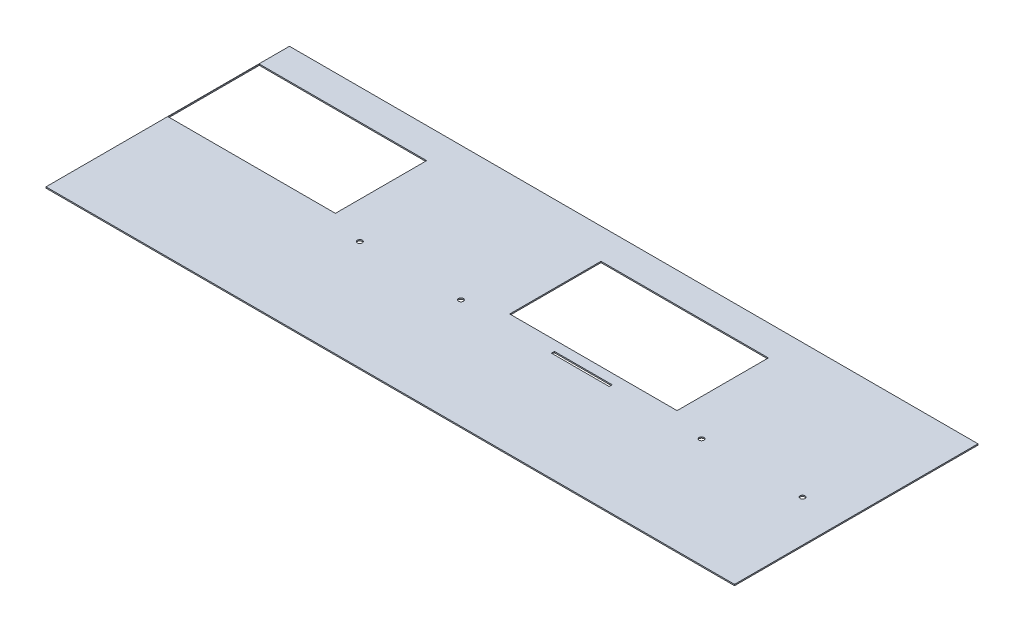
ISO-10303-21;
HEADER;
FILE_DESCRIPTION(('STEP AP214'),'2;1');
FILE_NAME('part.step','',(''),(''),'','','');
FILE_SCHEMA(('AUTOMOTIVE_DESIGN { 1 0 10303 214 1 1 1 1 }'));
ENDSEC;
DATA;
#1=APPLICATION_CONTEXT('core data for automotive mechanical design processes');
#2=APPLICATION_PROTOCOL_DEFINITION('international standard','automotive_design',2000,#1);
#3=PRODUCT_CONTEXT('',#1,'mechanical');
#4=PRODUCT('Part','Part','',(#3));
#5=PRODUCT_RELATED_PRODUCT_CATEGORY('part','',(#4));
#6=PRODUCT_DEFINITION_FORMATION('','',#4);
#7=PRODUCT_DEFINITION_CONTEXT('part definition',#1,'design');
#8=PRODUCT_DEFINITION('design','',#6,#7);
#9=PRODUCT_DEFINITION_SHAPE('','',#8);
#10=(LENGTH_UNIT() NAMED_UNIT(*) SI_UNIT(.MILLI.,.METRE.));
#11=(NAMED_UNIT(*) PLANE_ANGLE_UNIT() SI_UNIT($,.RADIAN.));
#12=(NAMED_UNIT(*) SI_UNIT($,.STERADIAN.) SOLID_ANGLE_UNIT());
#13=UNCERTAINTY_MEASURE_WITH_UNIT(LENGTH_MEASURE(1.E-05),#10,'distance_accuracy_value','');
#14=(GEOMETRIC_REPRESENTATION_CONTEXT(3) GLOBAL_UNCERTAINTY_ASSIGNED_CONTEXT((#13)) GLOBAL_UNIT_ASSIGNED_CONTEXT((#10,
#11,#12)) REPRESENTATION_CONTEXT('',''));
#15=CARTESIAN_POINT('',(0.,0.,0.));
#16=DIRECTION('',(0.,0.,1.));
#17=DIRECTION('',(1.,0.,0.));
#18=AXIS2_PLACEMENT_3D('',#15,#16,#17);
#19=CARTESIAN_POINT('',(142.,2.,200.));
#20=DIRECTION('',(0.,0.,-1.));
#21=DIRECTION('',(-1.,0.,0.));
#22=AXIS2_PLACEMENT_3D('',#19,#20,#21);
#23=PLANE('',#22);
#24=DIRECTION('',(1.,0.,0.));
#25=VECTOR('',#24,1.);
#26=CARTESIAN_POINT('',(142.,0.,200.));
#27=LINE('',#26,#25);
#28=CARTESIAN_POINT('',(-699.424777960769,-5.80091530366644E-12,200.));
#29=VERTEX_POINT('',#28);
#30=CARTESIAN_POINT('',(431.924777960769,-2.19269047363468E-12,200.));
#31=VERTEX_POINT('',#30);
#32=EDGE_CURVE('E253',#29,#31,#27,.T.);
#33=ORIENTED_EDGE('',*,*,#32,.T.);
#34=DIRECTION('',(0.,1.,0.));
#35=VECTOR('',#34,1.);
#36=CARTESIAN_POINT('',(431.924777960769,-2.13717932240343E-12,200.));
#37=LINE('',#36,#35);
#38=CARTESIAN_POINT('',(431.924777960769,1.99999999999781,200.));
#39=VERTEX_POINT('',#38);
#40=EDGE_CURVE('E318',#31,#39,#37,.T.);
#41=ORIENTED_EDGE('',*,*,#40,.T.);
#42=DIRECTION('',(1.,0.,0.));
#43=VECTOR('',#42,1.);
#44=CARTESIAN_POINT('',(142.,2.,200.));
#45=LINE('',#44,#43);
#46=CARTESIAN_POINT('',(-699.424777960769,1.9999999999942,200.));
#47=VERTEX_POINT('',#46);
#48=EDGE_CURVE('E137',#47,#39,#45,.T.);
#49=ORIENTED_EDGE('',*,*,#48,.F.);
#50=DIRECTION('',(0.,1.,0.));
#51=VECTOR('',#50,1.);
#52=CARTESIAN_POINT('',(-699.424777960769,-5.80091530366644E-12,200.));
#53=LINE('',#52,#51);
#54=EDGE_CURVE('E302',#29,#47,#53,.T.);
#55=ORIENTED_EDGE('',*,*,#54,.F.);
#56=EDGE_LOOP('',(#33,#41,#49,#55));
#57=FACE_BOUND('',#56,.T.);
#58=ADVANCED_FACE('F128',(#57),#23,.F.);
#59=CARTESIAN_POINT('',(142.,2.,-200.));
#60=DIRECTION('',(0.,0.,1.));
#61=DIRECTION('',(1.,0.,0.));
#62=AXIS2_PLACEMENT_3D('',#59,#60,#61);
#63=PLANE('',#62);
#64=DIRECTION('',(-1.,0.,0.));
#65=VECTOR('',#64,1.);
#66=CARTESIAN_POINT('',(142.,2.,-200.));
#67=LINE('',#66,#65);
#68=CARTESIAN_POINT('',(431.924777960769,1.99999999999781,-200.));
#69=VERTEX_POINT('',#68);
#70=CARTESIAN_POINT('',(-699.424777960769,1.9999999999942,-200.));
#71=VERTEX_POINT('',#70);
#72=EDGE_CURVE('E13',#69,#71,#67,.T.);
#73=ORIENTED_EDGE('',*,*,#72,.F.);
#74=DIRECTION('',(0.,1.,0.));
#75=VECTOR('',#74,1.);
#76=CARTESIAN_POINT('',(431.924777960769,-2.13717932240343E-12,-200.));
#77=LINE('',#76,#75);
#78=CARTESIAN_POINT('',(431.924777960769,-2.19269047363468E-12,-200.));
#79=VERTEX_POINT('',#78);
#80=EDGE_CURVE('E249',#79,#69,#77,.T.);
#81=ORIENTED_EDGE('',*,*,#80,.F.);
#82=DIRECTION('',(-1.,0.,0.));
#83=VECTOR('',#82,1.);
#84=CARTESIAN_POINT('',(142.,0.,-200.));
#85=LINE('',#84,#83);
#86=CARTESIAN_POINT('',(-699.424777960769,-5.80091530366644E-12,-200.));
#87=VERTEX_POINT('',#86);
#88=EDGE_CURVE('E243',#79,#87,#85,.T.);
#89=ORIENTED_EDGE('',*,*,#88,.T.);
#90=DIRECTION('',(0.,1.,0.));
#91=VECTOR('',#90,1.);
#92=CARTESIAN_POINT('',(-699.424777960769,-5.80091530366644E-12,-200.));
#93=LINE('',#92,#91);
#94=EDGE_CURVE('E247',#87,#71,#93,.T.);
#95=ORIENTED_EDGE('',*,*,#94,.T.);
#96=EDGE_LOOP('',(#73,#81,#89,#95));
#97=FACE_BOUND('',#96,.T.);
#98=ADVANCED_FACE('F245',(#97),#63,.F.);
#99=CARTESIAN_POINT('',(0.,2.,0.));
#100=DIRECTION('',(0.,1.,0.));
#101=DIRECTION('',(0.,0.,1.));
#102=AXIS2_PLACEMENT_3D('',#99,#100,#101);
#103=PLANE('',#102);
#104=DIRECTION('',(1.,0.,0.));
#105=VECTOR('',#104,1.);
#106=CARTESIAN_POINT('',(-47.5,2.,16.4999999999999));
#107=LINE('',#106,#105);
#108=CARTESIAN_POINT('',(-47.5,2.,16.4999999999999));
#109=VERTEX_POINT('',#108);
#110=CARTESIAN_POINT('',(47.5,2.,16.4999999999999));
#111=VERTEX_POINT('',#110);
#112=EDGE_CURVE('E329',#109,#111,#107,.T.);
#113=ORIENTED_EDGE('',*,*,#112,.T.);
#114=DIRECTION('',(0.,0.,1.));
#115=VECTOR('',#114,1.);
#116=CARTESIAN_POINT('',(47.5,2.,21.4999999999999));
#117=LINE('',#116,#115);
#118=CARTESIAN_POINT('',(47.5,2.,21.4999999999999));
#119=VERTEX_POINT('',#118);
#120=EDGE_CURVE('E348',#111,#119,#117,.T.);
#121=ORIENTED_EDGE('',*,*,#120,.T.);
#122=DIRECTION('',(-1.,0.,0.));
#123=VECTOR('',#122,1.);
#124=CARTESIAN_POINT('',(-47.5,2.,21.4999999999999));
#125=LINE('',#124,#123);
#126=CARTESIAN_POINT('',(-47.5,2.,21.4999999999999));
#127=VERTEX_POINT('',#126);
#128=EDGE_CURVE('E344',#119,#127,#125,.T.);
#129=ORIENTED_EDGE('',*,*,#128,.T.);
#130=DIRECTION('',(0.,0.,-1.));
#131=VECTOR('',#130,1.);
#132=CARTESIAN_POINT('',(-47.5,2.,21.4999999999999));
#133=LINE('',#132,#131);
#134=EDGE_CURVE('E340',#127,#109,#133,.T.);
#135=ORIENTED_EDGE('',*,*,#134,.T.);
#136=EDGE_LOOP('',(#113,#121,#129,#135));
#137=FACE_BOUND('',#136,.T.);
#138=DIRECTION('',(0.,0.,1.));
#139=VECTOR('',#138,1.);
#140=CARTESIAN_POINT('',(-137.5,2.,0.));
#141=LINE('',#140,#139);
#142=CARTESIAN_POINT('',(-137.5,2.,-150.));
#143=VERTEX_POINT('',#142);
#144=CARTESIAN_POINT('',(-137.5,2.,0.));
#145=VERTEX_POINT('',#144);
#146=EDGE_CURVE('E374',#143,#145,#141,.T.);
#147=ORIENTED_EDGE('',*,*,#146,.F.);
#148=DIRECTION('',(-1.,0.,0.));
#149=VECTOR('',#148,1.);
#150=CARTESIAN_POINT('',(0.,2.,-150.));
#151=LINE('',#150,#149);
#152=CARTESIAN_POINT('',(137.5,2.,-150.));
#153=VERTEX_POINT('',#152);
#154=EDGE_CURVE('E366',#153,#143,#151,.T.);
#155=ORIENTED_EDGE('',*,*,#154,.F.);
#156=DIRECTION('',(0.,0.,-1.));
#157=VECTOR('',#156,1.);
#158=CARTESIAN_POINT('',(137.5,2.,0.));
#159=LINE('',#158,#157);
#160=CARTESIAN_POINT('',(137.5,2.,0.));
#161=VERTEX_POINT('',#160);
#162=EDGE_CURVE('E368',#161,#153,#159,.T.);
#163=ORIENTED_EDGE('',*,*,#162,.F.);
#164=DIRECTION('',(1.,0.,0.));
#165=VECTOR('',#164,1.);
#166=CARTESIAN_POINT('',(0.,2.,0.));
#167=LINE('',#166,#165);
#168=EDGE_CURVE('E372',#145,#161,#167,.T.);
#169=ORIENTED_EDGE('',*,*,#168,.F.);
#170=EDGE_LOOP('',(#147,#155,#163,#169));
#171=FACE_BOUND('',#170,.T.);
#172=ORIENTED_EDGE('',*,*,#48,.T.);
#173=DIRECTION('',(0.,0.,-1.));
#174=VECTOR('',#173,1.);
#175=CARTESIAN_POINT('',(431.924777960769,1.99999999999781,200.));
#176=LINE('',#175,#174);
#177=EDGE_CURVE('E324',#69,#39,#176,.F.);
#178=ORIENTED_EDGE('',*,*,#177,.F.);
#179=ORIENTED_EDGE('',*,*,#72,.T.);
#180=DIRECTION('',(0.,0.,1.));
#181=VECTOR('',#180,1.);
#182=CARTESIAN_POINT('',(-699.424777960769,1.9999999999942,-200.));
#183=LINE('',#182,#181);
#184=EDGE_CURVE('E266',#47,#71,#183,.F.);
#185=ORIENTED_EDGE('',*,*,#184,.F.);
#186=EDGE_LOOP('',(#172,#178,#179,#185));
#187=FACE_BOUND('',#186,.T.);
#188=CARTESIAN_POINT('',(197.712388980385,1.99999999999964,19.9999999999999));
#189=DIRECTION('',(0.,-1.,0.));
#190=DIRECTION('',(1.,0.,0.));
#191=AXIS2_PLACEMENT_3D('',#188,#189,#190);
#192=CIRCLE('',#191,4.00000000000001);
#193=CARTESIAN_POINT('',(201.712388980385,1.99999999999956,19.9999999999999));
#194=VERTEX_POINT('',#193);
#195=EDGE_CURVE('E309',#194,#194,#192,.T.);
#196=ORIENTED_EDGE('',*,*,#195,.T.);
#197=EDGE_LOOP('',(#196));
#198=FACE_BOUND('',#197,.T.);
#199=CARTESIAN_POINT('',(363.712388980385,1.99999999999848,20.));
#200=DIRECTION('',(0.,-1.,0.));
#201=DIRECTION('',(1.,0.,0.));
#202=AXIS2_PLACEMENT_3D('',#199,#200,#201);
#203=CIRCLE('',#202,4.00000000000001);
#204=CARTESIAN_POINT('',(367.712388980385,1.99999999999845,20.));
#205=VERTEX_POINT('',#204);
#206=EDGE_CURVE('E305',#205,#205,#203,.T.);
#207=ORIENTED_EDGE('',*,*,#206,.T.);
#208=EDGE_LOOP('',(#207));
#209=FACE_BOUND('',#208,.T.);
#210=DIRECTION('',(0.,0.,-1.));
#211=VECTOR('',#210,1.);
#212=CARTESIAN_POINT('',(-423.92477796077,1.99999999999806,0.));
#213=LINE('',#212,#211);
#214=CARTESIAN_POINT('',(-423.92477796077,1.99999999999712,0.));
#215=VERTEX_POINT('',#214);
#216=CARTESIAN_POINT('',(-423.92477796077,1.99999999999806,-150.));
#217=VERTEX_POINT('',#216);
#218=EDGE_CURVE('E278',#215,#217,#213,.T.);
#219=ORIENTED_EDGE('',*,*,#218,.F.);
#220=DIRECTION('',(1.,0.,0.));
#221=VECTOR('',#220,1.);
#222=CARTESIAN_POINT('',(-561.424777960768,1.99999999999614,0.));
#223=LINE('',#222,#221);
#224=CARTESIAN_POINT('',(-698.92477796077,1.99999999999423,0.));
#225=VERTEX_POINT('',#224);
#226=EDGE_CURVE('E286',#225,#215,#223,.T.);
#227=ORIENTED_EDGE('',*,*,#226,.F.);
#228=DIRECTION('',(0.,0.,1.));
#229=VECTOR('',#228,1.);
#230=CARTESIAN_POINT('',(-698.92477796077,1.99999999999423,0.));
#231=LINE('',#230,#229);
#232=CARTESIAN_POINT('',(-698.92477796077,1.99999999999517,-150.));
#233=VERTEX_POINT('',#232);
#234=EDGE_CURVE('E294',#233,#225,#231,.T.);
#235=ORIENTED_EDGE('',*,*,#234,.F.);
#236=DIRECTION('',(-1.,0.,0.));
#237=VECTOR('',#236,1.);
#238=CARTESIAN_POINT('',(-561.424777960768,1.99999999999614,-150.));
#239=LINE('',#238,#237);
#240=EDGE_CURVE('E300',#217,#233,#239,.T.);
#241=ORIENTED_EDGE('',*,*,#240,.F.);
#242=EDGE_LOOP('',(#219,#227,#235,#241));
#243=FACE_BOUND('',#242,.T.);
#244=CARTESIAN_POINT('',(-197.712388980386,1.99999999999964,19.9999999999999));
#245=DIRECTION('',(0.,-1.,0.));
#246=DIRECTION('',(1.,0.,0.));
#247=AXIS2_PLACEMENT_3D('',#244,#245,#246);
#248=CIRCLE('',#247,4.00000000000001);
#249=CARTESIAN_POINT('',(-201.712388980386,1.99999999999961,19.9999999999999));
#250=VERTEX_POINT('',#249);
#251=EDGE_CURVE('E267',#250,#250,#248,.T.);
#252=ORIENTED_EDGE('',*,*,#251,.T.);
#253=EDGE_LOOP('',(#252));
#254=FACE_BOUND('',#253,.T.);
#255=CARTESIAN_POINT('',(-363.712388980386,1.99999999999848,20.));
#256=DIRECTION('',(0.,-1.,0.));
#257=DIRECTION('',(1.,0.,0.));
#258=AXIS2_PLACEMENT_3D('',#255,#256,#257);
#259=CIRCLE('',#258,4.00000000000001);
#260=CARTESIAN_POINT('',(-367.712388980386,1.99999999999845,20.));
#261=VERTEX_POINT('',#260);
#262=EDGE_CURVE('E270',#261,#261,#259,.T.);
#263=ORIENTED_EDGE('',*,*,#262,.T.);
#264=EDGE_LOOP('',(#263));
#265=FACE_BOUND('',#264,.T.);
#266=ADVANCED_FACE('F400',(#137,#171,#187,#198,#209,#243,#254,#265),#103,.T.);
#267=CARTESIAN_POINT('',(0.,0.,0.));
#268=DIRECTION('',(0.,1.,0.));
#269=DIRECTION('',(0.,0.,1.));
#270=AXIS2_PLACEMENT_3D('',#267,#268,#269);
#271=PLANE('',#270);
#272=DIRECTION('',(0.,0.,1.));
#273=VECTOR('',#272,1.);
#274=CARTESIAN_POINT('',(47.5,0.,21.4999999999999));
#275=LINE('',#274,#273);
#276=CARTESIAN_POINT('',(47.5,0.,16.4999999999999));
#277=VERTEX_POINT('',#276);
#278=CARTESIAN_POINT('',(47.5,0.,21.4999999999999));
#279=VERTEX_POINT('',#278);
#280=EDGE_CURVE('E330',#277,#279,#275,.T.);
#281=ORIENTED_EDGE('',*,*,#280,.F.);
#282=DIRECTION('',(1.,0.,0.));
#283=VECTOR('',#282,1.);
#284=CARTESIAN_POINT('',(-47.5,0.,16.4999999999999));
#285=LINE('',#284,#283);
#286=CARTESIAN_POINT('',(-47.5,0.,16.4999999999999));
#287=VERTEX_POINT('',#286);
#288=EDGE_CURVE('E333',#287,#277,#285,.T.);
#289=ORIENTED_EDGE('',*,*,#288,.F.);
#290=DIRECTION('',(0.,0.,-1.));
#291=VECTOR('',#290,1.);
#292=CARTESIAN_POINT('',(-47.5,0.,21.4999999999999));
#293=LINE('',#292,#291);
#294=CARTESIAN_POINT('',(-47.5,0.,21.4999999999999));
#295=VERTEX_POINT('',#294);
#296=EDGE_CURVE('E308',#295,#287,#293,.T.);
#297=ORIENTED_EDGE('',*,*,#296,.F.);
#298=DIRECTION('',(-1.,0.,0.));
#299=VECTOR('',#298,1.);
#300=CARTESIAN_POINT('',(-47.5,0.,21.4999999999999));
#301=LINE('',#300,#299);
#302=EDGE_CURVE('E153',#279,#295,#301,.T.);
#303=ORIENTED_EDGE('',*,*,#302,.F.);
#304=EDGE_LOOP('',(#281,#289,#297,#303));
#305=FACE_BOUND('',#304,.T.);
#306=DIRECTION('',(1.,0.,0.));
#307=VECTOR('',#306,1.);
#308=CARTESIAN_POINT('',(-137.5,0.,-150.));
#309=LINE('',#308,#307);
#310=CARTESIAN_POINT('',(-137.5,0.,-150.));
#311=VERTEX_POINT('',#310);
#312=CARTESIAN_POINT('',(137.5,0.,-150.));
#313=VERTEX_POINT('',#312);
#314=EDGE_CURVE('E357',#311,#313,#309,.T.);
#315=ORIENTED_EDGE('',*,*,#314,.F.);
#316=DIRECTION('',(0.,0.,-1.));
#317=VECTOR('',#316,1.);
#318=CARTESIAN_POINT('',(-137.5,0.,0.));
#319=LINE('',#318,#317);
#320=CARTESIAN_POINT('',(-137.5,0.,0.));
#321=VERTEX_POINT('',#320);
#322=EDGE_CURVE('E355',#321,#311,#319,.T.);
#323=ORIENTED_EDGE('',*,*,#322,.F.);
#324=DIRECTION('',(-1.,0.,0.));
#325=VECTOR('',#324,1.);
#326=CARTESIAN_POINT('',(-137.5,0.,0.));
#327=LINE('',#326,#325);
#328=CARTESIAN_POINT('',(137.5,0.,0.));
#329=VERTEX_POINT('',#328);
#330=EDGE_CURVE('E363',#329,#321,#327,.T.);
#331=ORIENTED_EDGE('',*,*,#330,.F.);
#332=DIRECTION('',(0.,0.,1.));
#333=VECTOR('',#332,1.);
#334=CARTESIAN_POINT('',(137.5,0.,0.));
#335=LINE('',#334,#333);
#336=EDGE_CURVE('E360',#313,#329,#335,.T.);
#337=ORIENTED_EDGE('',*,*,#336,.F.);
#338=EDGE_LOOP('',(#315,#323,#331,#337));
#339=FACE_BOUND('',#338,.T.);
#340=ORIENTED_EDGE('',*,*,#88,.F.);
#341=DIRECTION('',(0.,0.,1.));
#342=VECTOR('',#341,1.);
#343=CARTESIAN_POINT('',(431.924777960769,-2.19269047363468E-12,0.));
#344=LINE('',#343,#342);
#345=EDGE_CURVE('E321',#79,#31,#344,.T.);
#346=ORIENTED_EDGE('',*,*,#345,.T.);
#347=ORIENTED_EDGE('',*,*,#32,.F.);
#348=DIRECTION('',(0.,0.,-1.));
#349=VECTOR('',#348,1.);
#350=CARTESIAN_POINT('',(-699.424777960769,-5.80091530366644E-12,0.));
#351=LINE('',#350,#349);
#352=EDGE_CURVE('E256',#29,#87,#351,.T.);
#353=ORIENTED_EDGE('',*,*,#352,.T.);
#354=EDGE_LOOP('',(#340,#346,#347,#353));
#355=FACE_BOUND('',#354,.T.);
#356=CARTESIAN_POINT('',(197.712388980385,-3.60822483003176E-13,19.9999999999999));
#357=DIRECTION('',(0.,-1.,0.));
#358=DIRECTION('',(1.,0.,0.));
#359=AXIS2_PLACEMENT_3D('',#356,#357,#358);
#360=CIRCLE('',#359,4.00000000000001);
#361=CARTESIAN_POINT('',(201.712388980385,-4.44089209850063E-13,19.9999999999999));
#362=VERTEX_POINT('',#361);
#363=EDGE_CURVE('E312',#362,#362,#360,.T.);
#364=ORIENTED_EDGE('',*,*,#363,.F.);
#365=EDGE_LOOP('',(#364));
#366=FACE_BOUND('',#365,.T.);
#367=CARTESIAN_POINT('',(363.712388980385,-1.52655665885959E-12,20.));
#368=DIRECTION('',(0.,-1.,0.));
#369=DIRECTION('',(1.,0.,0.));
#370=AXIS2_PLACEMENT_3D('',#367,#368,#369);
#371=CIRCLE('',#370,4.00000000000001);
#372=CARTESIAN_POINT('',(367.712388980385,-1.55431223447522E-12,20.));
#373=VERTEX_POINT('',#372);
#374=EDGE_CURVE('E315',#373,#373,#371,.T.);
#375=ORIENTED_EDGE('',*,*,#374,.F.);
#376=EDGE_LOOP('',(#375));
#377=FACE_BOUND('',#376,.T.);
#378=CARTESIAN_POINT('',(-197.712388980386,-3.60822483003176E-13,19.9999999999999));
#379=DIRECTION('',(0.,-1.,0.));
#380=DIRECTION('',(1.,0.,0.));
#381=AXIS2_PLACEMENT_3D('',#378,#379,#380);
#382=CIRCLE('',#381,4.00000000000001);
#383=CARTESIAN_POINT('',(-201.712388980386,-3.86843335142828E-13,19.9999999999999));
#384=VERTEX_POINT('',#383);
#385=EDGE_CURVE('E784',#384,#384,#382,.F.);
#386=ORIENTED_EDGE('',*,*,#385,.T.);
#387=EDGE_LOOP('',(#386));
#388=FACE_BOUND('',#387,.T.);
#389=CARTESIAN_POINT('',(-363.712388980386,-1.52655665885959E-12,20.));
#390=DIRECTION('',(0.,-1.,0.));
#391=DIRECTION('',(1.,0.,0.));
#392=AXIS2_PLACEMENT_3D('',#389,#390,#391);
#393=CIRCLE('',#392,4.00000000000001);
#394=CARTESIAN_POINT('',(-367.712388980386,-1.55257751099924E-12,20.));
#395=VERTEX_POINT('',#394);
#396=EDGE_CURVE('E327',#395,#395,#393,.F.);
#397=ORIENTED_EDGE('',*,*,#396,.T.);
#398=EDGE_LOOP('',(#397));
#399=FACE_BOUND('',#398,.T.);
#400=DIRECTION('',(-1.,0.,0.));
#401=VECTOR('',#400,1.);
#402=CARTESIAN_POINT('',(-423.924777960772,-1.94289029309402E-12,0.));
#403=LINE('',#402,#401);
#404=CARTESIAN_POINT('',(-423.92477796077,-1.94289029309402E-12,0.));
#405=VERTEX_POINT('',#404);
#406=CARTESIAN_POINT('',(-698.92477796077,-5.77315972805081E-12,0.));
#407=VERTEX_POINT('',#406);
#408=EDGE_CURVE('E284',#405,#407,#403,.T.);
#409=ORIENTED_EDGE('',*,*,#408,.F.);
#410=DIRECTION('',(0.,0.,1.));
#411=VECTOR('',#410,1.);
#412=CARTESIAN_POINT('',(-423.92477796077,-1.94289029309402E-12,0.));
#413=LINE('',#412,#411);
#414=CARTESIAN_POINT('',(-423.92477796077,-1.94289029309402E-12,-150.));
#415=VERTEX_POINT('',#414);
#416=EDGE_CURVE('E276',#415,#405,#413,.T.);
#417=ORIENTED_EDGE('',*,*,#416,.F.);
#418=DIRECTION('',(1.,0.,0.));
#419=VECTOR('',#418,1.);
#420=CARTESIAN_POINT('',(-423.924777960772,-1.94289029309402E-12,-150.));
#421=LINE('',#420,#419);
#422=CARTESIAN_POINT('',(-698.92477796077,-5.77315972805081E-12,-150.));
#423=VERTEX_POINT('',#422);
#424=EDGE_CURVE('E298',#423,#415,#421,.T.);
#425=ORIENTED_EDGE('',*,*,#424,.F.);
#426=DIRECTION('',(0.,0.,-1.));
#427=VECTOR('',#426,1.);
#428=CARTESIAN_POINT('',(-698.92477796077,-5.77315972805081E-12,0.));
#429=LINE('',#428,#427);
#430=EDGE_CURVE('E291',#407,#423,#429,.T.);
#431=ORIENTED_EDGE('',*,*,#430,.F.);
#432=EDGE_LOOP('',(#409,#417,#425,#431));
#433=FACE_BOUND('',#432,.T.);
#434=ADVANCED_FACE('F130',(#305,#339,#355,#366,#377,#388,#399,#433),#271,.F.);
#435=CARTESIAN_POINT('',(-137.5,597.249102153543,0.));
#436=DIRECTION('',(-1.,0.,0.));
#437=DIRECTION('',(0.,0.,1.));
#438=AXIS2_PLACEMENT_3D('',#435,#436,#437);
#439=PLANE('',#438);
#440=ORIENTED_EDGE('',*,*,#146,.T.);
#441=DIRECTION('',(0.,-1.,0.));
#442=VECTOR('',#441,1.);
#443=CARTESIAN_POINT('',(-137.5,597.249102153543,0.));
#444=LINE('',#443,#442);
#445=EDGE_CURVE('E369',#145,#321,#444,.T.);
#446=ORIENTED_EDGE('',*,*,#445,.T.);
#447=ORIENTED_EDGE('',*,*,#322,.T.);
#448=DIRECTION('',(0.,-1.,0.));
#449=VECTOR('',#448,1.);
#450=CARTESIAN_POINT('',(-137.5,597.249102153543,-150.));
#451=LINE('',#450,#449);
#452=EDGE_CURVE('E132',#143,#311,#451,.T.);
#453=ORIENTED_EDGE('',*,*,#452,.F.);
#454=EDGE_LOOP('',(#440,#446,#447,#453));
#455=FACE_BOUND('',#454,.T.);
#456=ADVANCED_FACE('F403',(#455),#439,.F.);
#457=CARTESIAN_POINT('',(-137.5,597.249102153543,0.));
#458=DIRECTION('',(0.,0.,1.));
#459=DIRECTION('',(1.,0.,0.));
#460=AXIS2_PLACEMENT_3D('',#457,#458,#459);
#461=PLANE('',#460);
#462=ORIENTED_EDGE('',*,*,#168,.T.);
#463=DIRECTION('',(0.,-1.,0.));
#464=VECTOR('',#463,1.);
#465=CARTESIAN_POINT('',(137.5,597.249102153543,0.));
#466=LINE('',#465,#464);
#467=EDGE_CURVE('E379',#161,#329,#466,.T.);
#468=ORIENTED_EDGE('',*,*,#467,.T.);
#469=ORIENTED_EDGE('',*,*,#330,.T.);
#470=ORIENTED_EDGE('',*,*,#445,.F.);
#471=EDGE_LOOP('',(#462,#468,#469,#470));
#472=FACE_BOUND('',#471,.T.);
#473=ADVANCED_FACE('F404',(#472),#461,.F.);
#474=CARTESIAN_POINT('',(137.5,597.249102153543,0.));
#475=DIRECTION('',(1.,0.,0.));
#476=DIRECTION('',(0.,0.,-1.));
#477=AXIS2_PLACEMENT_3D('',#474,#475,#476);
#478=PLANE('',#477);
#479=ORIENTED_EDGE('',*,*,#162,.T.);
#480=DIRECTION('',(0.,-1.,0.));
#481=VECTOR('',#480,1.);
#482=CARTESIAN_POINT('',(137.5,597.249102153543,-150.));
#483=LINE('',#482,#481);
#484=EDGE_CURVE('E380',#153,#313,#483,.T.);
#485=ORIENTED_EDGE('',*,*,#484,.T.);
#486=ORIENTED_EDGE('',*,*,#336,.T.);
#487=ORIENTED_EDGE('',*,*,#467,.F.);
#488=EDGE_LOOP('',(#479,#485,#486,#487));
#489=FACE_BOUND('',#488,.T.);
#490=ADVANCED_FACE('F395',(#489),#478,.F.);
#491=CARTESIAN_POINT('',(-137.5,597.249102153543,-150.));
#492=DIRECTION('',(0.,0.,-1.));
#493=DIRECTION('',(-1.,0.,0.));
#494=AXIS2_PLACEMENT_3D('',#491,#492,#493);
#495=PLANE('',#494);
#496=ORIENTED_EDGE('',*,*,#154,.T.);
#497=ORIENTED_EDGE('',*,*,#452,.T.);
#498=ORIENTED_EDGE('',*,*,#314,.T.);
#499=ORIENTED_EDGE('',*,*,#484,.F.);
#500=EDGE_LOOP('',(#496,#497,#498,#499));
#501=FACE_BOUND('',#500,.T.);
#502=ADVANCED_FACE('F386',(#501),#495,.F.);
#503=CARTESIAN_POINT('',(-47.5,97.1314879522022,16.4999999999999));
#504=DIRECTION('',(0.,0.,-1.));
#505=DIRECTION('',(-1.,0.,0.));
#506=AXIS2_PLACEMENT_3D('',#503,#504,#505);
#507=PLANE('',#506);
#508=DIRECTION('',(0.,-1.,0.));
#509=VECTOR('',#508,1.);
#510=CARTESIAN_POINT('',(-47.5,97.1314879522022,16.4999999999999));
#511=LINE('',#510,#509);
#512=EDGE_CURVE('E145',#109,#287,#511,.T.);
#513=ORIENTED_EDGE('',*,*,#512,.T.);
#514=ORIENTED_EDGE('',*,*,#288,.T.);
#515=DIRECTION('',(0.,-1.,0.));
#516=VECTOR('',#515,1.);
#517=CARTESIAN_POINT('',(47.5,97.1314879522022,16.4999999999999));
#518=LINE('',#517,#516);
#519=EDGE_CURVE('E339',#111,#277,#518,.T.);
#520=ORIENTED_EDGE('',*,*,#519,.F.);
#521=ORIENTED_EDGE('',*,*,#112,.F.);
#522=EDGE_LOOP('',(#513,#514,#520,#521));
#523=FACE_BOUND('',#522,.T.);
#524=ADVANCED_FACE('F423',(#523),#507,.F.);
#525=CARTESIAN_POINT('',(47.5,97.1314879522022,21.4999999999999));
#526=DIRECTION('',(1.,0.,0.));
#527=DIRECTION('',(0.,0.,-1.));
#528=AXIS2_PLACEMENT_3D('',#525,#526,#527);
#529=PLANE('',#528);
#530=ORIENTED_EDGE('',*,*,#519,.T.);
#531=ORIENTED_EDGE('',*,*,#280,.T.);
#532=DIRECTION('',(0.,-1.,0.));
#533=VECTOR('',#532,1.);
#534=CARTESIAN_POINT('',(47.5,97.1314879522022,21.4999999999999));
#535=LINE('',#534,#533);
#536=EDGE_CURVE('E347',#119,#279,#535,.T.);
#537=ORIENTED_EDGE('',*,*,#536,.F.);
#538=ORIENTED_EDGE('',*,*,#120,.F.);
#539=EDGE_LOOP('',(#530,#531,#537,#538));
#540=FACE_BOUND('',#539,.T.);
#541=ADVANCED_FACE('F427',(#540),#529,.F.);
#542=CARTESIAN_POINT('',(-47.5,97.1314879522022,21.4999999999999));
#543=DIRECTION('',(0.,0.,1.));
#544=DIRECTION('',(1.,0.,0.));
#545=AXIS2_PLACEMENT_3D('',#542,#543,#544);
#546=PLANE('',#545);
#547=ORIENTED_EDGE('',*,*,#536,.T.);
#548=ORIENTED_EDGE('',*,*,#302,.T.);
#549=DIRECTION('',(0.,-1.,0.));
#550=VECTOR('',#549,1.);
#551=CARTESIAN_POINT('',(-47.5,97.1314879522022,21.4999999999999));
#552=LINE('',#551,#550);
#553=EDGE_CURVE('E343',#127,#295,#552,.T.);
#554=ORIENTED_EDGE('',*,*,#553,.F.);
#555=ORIENTED_EDGE('',*,*,#128,.F.);
#556=EDGE_LOOP('',(#547,#548,#554,#555));
#557=FACE_BOUND('',#556,.T.);
#558=ADVANCED_FACE('F433',(#557),#546,.F.);
#559=CARTESIAN_POINT('',(-47.5,97.1314879522022,21.4999999999999));
#560=DIRECTION('',(-1.,0.,0.));
#561=DIRECTION('',(0.,0.,1.));
#562=AXIS2_PLACEMENT_3D('',#559,#560,#561);
#563=PLANE('',#562);
#564=ORIENTED_EDGE('',*,*,#553,.T.);
#565=ORIENTED_EDGE('',*,*,#296,.T.);
#566=ORIENTED_EDGE('',*,*,#512,.F.);
#567=ORIENTED_EDGE('',*,*,#134,.F.);
#568=EDGE_LOOP('',(#564,#565,#566,#567));
#569=FACE_BOUND('',#568,.T.);
#570=ADVANCED_FACE('F448',(#569),#563,.F.);
#571=CARTESIAN_POINT('',(431.924777960769,-2.13717932240343E-12,200.));
#572=DIRECTION('',(-1.,0.,0.));
#573=DIRECTION('',(0.,-1.,0.));
#574=AXIS2_PLACEMENT_3D('',#571,#572,#573);
#575=PLANE('',#574);
#576=ORIENTED_EDGE('',*,*,#177,.T.);
#577=ORIENTED_EDGE('',*,*,#40,.F.);
#578=ORIENTED_EDGE('',*,*,#345,.F.);
#579=ORIENTED_EDGE('',*,*,#80,.T.);
#580=EDGE_LOOP('',(#576,#577,#578,#579));
#581=FACE_BOUND('',#580,.T.);
#582=ADVANCED_FACE('F450',(#581),#575,.F.);
#583=CARTESIAN_POINT('',(363.712388980387,295.313708498985,20.));
#584=DIRECTION('',(0.,-1.,0.));
#585=DIRECTION('',(1.,0.,0.));
#586=AXIS2_PLACEMENT_3D('',#583,#584,#585);
#587=CYLINDRICAL_SURFACE('',#586,4.00000000000001);
#588=CARTESIAN_POINT('',(367.712388980385,-1.55431223447522E-12,20.));
#589=CARTESIAN_POINT('',(367.712388980385,0.020833333331786,20.));
#590=CARTESIAN_POINT('',(367.712388980385,0.0416666666651263,20.));
#591=CARTESIAN_POINT('',(367.712388980385,0.0833333333317883,20.));
#592=CARTESIAN_POINT('',(367.712388980385,0.10416666666511,20.));
#593=CARTESIAN_POINT('',(367.712388980385,0.145833333331772,20.));
#594=CARTESIAN_POINT('',(367.712388980385,0.166666666665113,20.));
#595=CARTESIAN_POINT('',(367.712388980385,0.208333333331775,20.));
#596=CARTESIAN_POINT('',(367.712388980385,0.229166666665096,20.));
#597=CARTESIAN_POINT('',(367.712388980385,0.270833333331758,20.));
#598=CARTESIAN_POINT('',(367.712388980385,0.291666666665099,20.));
#599=CARTESIAN_POINT('',(367.712388980385,0.333333333331779,20.));
#600=CARTESIAN_POINT('',(367.712388980385,0.35416666666512,20.));
#601=CARTESIAN_POINT('',(367.712388980385,0.395833333331782,20.));
#602=CARTESIAN_POINT('',(367.712388980385,0.416666666665103,20.));
#603=CARTESIAN_POINT('',(367.712388980385,0.458333333331766,20.));
#604=CARTESIAN_POINT('',(367.712388980385,0.479166666665106,20.));
#605=CARTESIAN_POINT('',(367.712388980385,0.520833333331786,20.));
#606=CARTESIAN_POINT('',(367.712388980385,0.541666666665127,20.));
#607=CARTESIAN_POINT('',(367.712388980385,0.583333333331789,20.));
#608=CARTESIAN_POINT('',(367.712388980385,0.604166666665111,20.));
#609=CARTESIAN_POINT('',(367.712388980385,0.645833333331773,20.));
#610=CARTESIAN_POINT('',(367.712388980385,0.666666666665113,20.));
#611=CARTESIAN_POINT('',(367.712388980385,0.708333333331793,20.));
#612=CARTESIAN_POINT('',(367.712388980385,0.729166666665134,20.));
#613=CARTESIAN_POINT('',(367.712388980385,0.770833333331796,20.));
#614=CARTESIAN_POINT('',(367.712388980385,0.791666666665118,20.));
#615=CARTESIAN_POINT('',(367.712388980385,0.83333333333178,20.));
#616=CARTESIAN_POINT('',(367.712388980385,0.85416666666512,20.));
#617=CARTESIAN_POINT('',(367.712388980385,0.895833333331782,20.));
#618=CARTESIAN_POINT('',(367.712388980385,0.916666666665104,20.));
#619=CARTESIAN_POINT('',(367.712388980385,0.958333333331766,20.));
#620=CARTESIAN_POINT('',(367.712388980385,0.979166666665106,20.));
#621=CARTESIAN_POINT('',(367.712388980385,1.02083333333179,20.));
#622=CARTESIAN_POINT('',(367.712388980385,1.04166666666513,20.));
#623=CARTESIAN_POINT('',(367.712388980385,1.08333333333179,20.));
#624=CARTESIAN_POINT('',(367.712388980385,1.10416666666511,20.));
#625=CARTESIAN_POINT('',(367.712388980385,1.14583333333177,20.));
#626=CARTESIAN_POINT('',(367.712388980385,1.16666666666511,20.));
#627=CARTESIAN_POINT('',(367.712388980385,1.20833333333178,20.));
#628=CARTESIAN_POINT('',(367.712388980385,1.2291666666651,20.));
#629=CARTESIAN_POINT('',(367.712388980385,1.27083333333176,20.));
#630=CARTESIAN_POINT('',(367.712388980385,1.2916666666651,20.));
#631=CARTESIAN_POINT('',(367.712388980385,1.33333333333178,20.));
#632=CARTESIAN_POINT('',(367.712388980385,1.35416666666512,20.));
#633=CARTESIAN_POINT('',(367.712388980385,1.39583333333178,20.));
#634=CARTESIAN_POINT('',(367.712388980385,1.4166666666651,20.));
#635=CARTESIAN_POINT('',(367.712388980385,1.45833333333177,20.));
#636=CARTESIAN_POINT('',(367.712388980385,1.47916666666511,20.));
#637=CARTESIAN_POINT('',(367.712388980385,1.52083333333179,20.));
#638=CARTESIAN_POINT('',(367.712388980385,1.54166666666513,20.));
#639=CARTESIAN_POINT('',(367.712388980385,1.58333333333179,20.));
#640=CARTESIAN_POINT('',(367.712388980385,1.60416666666511,20.));
#641=CARTESIAN_POINT('',(367.712388980385,1.64583333333177,20.));
#642=CARTESIAN_POINT('',(367.712388980385,1.66666666666511,20.));
#643=CARTESIAN_POINT('',(367.712388980385,1.70833333333179,20.));
#644=CARTESIAN_POINT('',(367.712388980385,1.72916666666513,20.));
#645=CARTESIAN_POINT('',(367.712388980385,1.7708333333318,20.));
#646=CARTESIAN_POINT('',(367.712388980385,1.79166666666512,20.));
#647=CARTESIAN_POINT('',(367.712388980385,1.83333333333178,20.));
#648=CARTESIAN_POINT('',(367.712388980385,1.85416666666512,20.));
#649=CARTESIAN_POINT('',(367.712388980385,1.89583333333178,20.));
#650=CARTESIAN_POINT('',(367.712388980385,1.9166666666651,20.));
#651=CARTESIAN_POINT('',(367.712388980385,1.95833333333177,20.));
#652=CARTESIAN_POINT('',(367.712388980385,1.97916666666511,20.));
#653=CARTESIAN_POINT('',(367.712388980385,1.99999999999845,20.));
#654=B_SPLINE_CURVE_WITH_KNOTS('',3,(#588,#589,#590,#591,#592,#593,#594,#595,#596,#597,#598,
#599,#600,#601,#602,#603,#604,#605,#606,#607,#608,#609,#610,#611,#612,#613,#614,#615,#616,#617,
#618,#619,#620,#621,#622,#623,#624,#625,#626,#627,#628,#629,#630,#631,#632,#633,#634,#635,#636,
#637,#638,#639,#640,#641,#642,#643,#644,#645,#646,#647,#648,#649,#650,#651,#652,#653),
.UNSPECIFIED.,.F.,.F.,(4,2,2,2,2,2,2,2,2,2,2,2,2,2,2,2,2,2,2,2,2,2,2,2,2,2,2,2,2,2,2,2,4),(0.,
0.0625000000000209,0.124999999999986,0.187500000000007,0.249999999999972,0.312499999999993,
0.375000000000014,0.43749999999998,0.5,0.562500000000021,0.624999999999987,0.687500000000008,
0.750000000000028,0.812499999999994,0.875000000000015,0.93749999999998,1.,1.06250000000002,
1.12499999999999,1.18750000000001,1.24999999999997,1.31249999999999,1.37500000000002,
1.43749999999998,1.5,1.56250000000002,1.62499999999999,1.68750000000001,1.75000000000003,
1.81249999999999,1.87500000000002,1.93749999999998,2.),.UNSPECIFIED.);
#655=EDGE_CURVE('BSEAM456',#373,#205,#654,.T.);
#656=ORIENTED_EDGE('',*,*,#374,.T.);
#657=ORIENTED_EDGE('',*,*,#206,.F.);
#658=ORIENTED_EDGE('',*,*,#655,.T.);
#659=ORIENTED_EDGE('',*,*,#655,.F.);
#660=EDGE_LOOP('',(#656,#658,#657,#659));
#661=FACE_BOUND('',#660,.T.);
#662=ADVANCED_FACE('F456',(#661),#587,.F.);
#663=CARTESIAN_POINT('',(197.712388980387,295.313708498986,19.9999999999999));
#664=DIRECTION('',(0.,-1.,0.));
#665=DIRECTION('',(1.,0.,0.));
#666=AXIS2_PLACEMENT_3D('',#663,#664,#665);
#667=CYLINDRICAL_SURFACE('',#666,4.00000000000001);
#668=CARTESIAN_POINT('',(201.712388980385,-4.44089209850063E-13,19.9999999999999));
#669=CARTESIAN_POINT('',(201.712388980385,0.0208333333328962,19.9999999999999));
#670=CARTESIAN_POINT('',(201.712388980385,0.0416666666662365,19.9999999999999));
#671=CARTESIAN_POINT('',(201.712388980385,0.0833333333328986,19.9999999999999));
#672=CARTESIAN_POINT('',(201.712388980385,0.10416666666622,19.9999999999999));
#673=CARTESIAN_POINT('',(201.712388980385,0.145833333332882,19.9999999999999));
#674=CARTESIAN_POINT('',(201.712388980385,0.166666666666223,19.9999999999999));
#675=CARTESIAN_POINT('',(201.712388980385,0.208333333332885,19.9999999999999));
#676=CARTESIAN_POINT('',(201.712388980385,0.229166666666207,19.9999999999999));
#677=CARTESIAN_POINT('',(201.712388980385,0.270833333332869,19.9999999999999));
#678=CARTESIAN_POINT('',(201.712388980385,0.291666666666209,19.9999999999999));
#679=CARTESIAN_POINT('',(201.712388980385,0.33333333333289,19.9999999999999));
#680=CARTESIAN_POINT('',(201.712388980385,0.35416666666623,19.9999999999999));
#681=CARTESIAN_POINT('',(201.712388980385,0.395833333332892,19.9999999999999));
#682=CARTESIAN_POINT('',(201.712388980385,0.416666666666214,19.9999999999999));
#683=CARTESIAN_POINT('',(201.712388980385,0.458333333332876,19.9999999999999));
#684=CARTESIAN_POINT('',(201.712388980385,0.479166666666216,19.9999999999999));
#685=CARTESIAN_POINT('',(201.712388980385,0.520833333332897,19.9999999999999));
#686=CARTESIAN_POINT('',(201.712388980385,0.541666666666237,19.9999999999999));
#687=CARTESIAN_POINT('',(201.712388980385,0.583333333332899,19.9999999999999));
#688=CARTESIAN_POINT('',(201.712388980385,0.604166666666221,19.9999999999999));
#689=CARTESIAN_POINT('',(201.712388980385,0.645833333332883,19.9999999999999));
#690=CARTESIAN_POINT('',(201.712388980385,0.666666666666223,19.9999999999999));
#691=CARTESIAN_POINT('',(201.712388980385,0.708333333332904,19.9999999999999));
#692=CARTESIAN_POINT('',(201.712388980385,0.729166666666244,19.9999999999999));
#693=CARTESIAN_POINT('',(201.712388980385,0.770833333332906,19.9999999999999));
#694=CARTESIAN_POINT('',(201.712388980385,0.791666666666228,19.9999999999999));
#695=CARTESIAN_POINT('',(201.712388980385,0.83333333333289,19.9999999999999));
#696=CARTESIAN_POINT('',(201.712388980385,0.85416666666623,19.9999999999999));
#697=CARTESIAN_POINT('',(201.712388980385,0.895833333332892,19.9999999999999));
#698=CARTESIAN_POINT('',(201.712388980385,0.916666666666214,19.9999999999999));
#699=CARTESIAN_POINT('',(201.712388980385,0.958333333332876,19.9999999999999));
#700=CARTESIAN_POINT('',(201.712388980385,0.979166666666216,19.9999999999999));
#701=CARTESIAN_POINT('',(201.712388980385,1.0208333333329,19.9999999999999));
#702=CARTESIAN_POINT('',(201.712388980385,1.04166666666624,19.9999999999999));
#703=CARTESIAN_POINT('',(201.712388980385,1.0833333333329,19.9999999999999));
#704=CARTESIAN_POINT('',(201.712388980385,1.10416666666622,19.9999999999999));
#705=CARTESIAN_POINT('',(201.712388980385,1.14583333333288,19.9999999999999));
#706=CARTESIAN_POINT('',(201.712388980385,1.16666666666622,19.9999999999999));
#707=CARTESIAN_POINT('',(201.712388980385,1.20833333333289,19.9999999999999));
#708=CARTESIAN_POINT('',(201.712388980385,1.22916666666621,19.9999999999999));
#709=CARTESIAN_POINT('',(201.712388980385,1.27083333333287,19.9999999999999));
#710=CARTESIAN_POINT('',(201.712388980385,1.29166666666621,19.9999999999999));
#711=CARTESIAN_POINT('',(201.712388980385,1.33333333333289,19.9999999999999));
#712=CARTESIAN_POINT('',(201.712388980385,1.35416666666623,19.9999999999999));
#713=CARTESIAN_POINT('',(201.712388980385,1.39583333333289,19.9999999999999));
#714=CARTESIAN_POINT('',(201.712388980385,1.41666666666621,19.9999999999999));
#715=CARTESIAN_POINT('',(201.712388980385,1.45833333333288,19.9999999999999));
#716=CARTESIAN_POINT('',(201.712388980385,1.47916666666622,19.9999999999999));
#717=CARTESIAN_POINT('',(201.712388980385,1.5208333333329,19.9999999999999));
#718=CARTESIAN_POINT('',(201.712388980385,1.54166666666624,19.9999999999999));
#719=CARTESIAN_POINT('',(201.712388980385,1.5833333333329,19.9999999999999));
#720=CARTESIAN_POINT('',(201.712388980385,1.60416666666622,19.9999999999999));
#721=CARTESIAN_POINT('',(201.712388980385,1.64583333333288,19.9999999999999));
#722=CARTESIAN_POINT('',(201.712388980385,1.66666666666622,19.9999999999999));
#723=CARTESIAN_POINT('',(201.712388980385,1.7083333333329,19.9999999999999));
#724=CARTESIAN_POINT('',(201.712388980385,1.72916666666624,19.9999999999999));
#725=CARTESIAN_POINT('',(201.712388980385,1.77083333333291,19.9999999999999));
#726=CARTESIAN_POINT('',(201.712388980385,1.79166666666623,19.9999999999999));
#727=CARTESIAN_POINT('',(201.712388980385,1.83333333333289,19.9999999999999));
#728=CARTESIAN_POINT('',(201.712388980385,1.85416666666623,19.9999999999999));
#729=CARTESIAN_POINT('',(201.712388980385,1.89583333333289,19.9999999999999));
#730=CARTESIAN_POINT('',(201.712388980385,1.91666666666622,19.9999999999999));
#731=CARTESIAN_POINT('',(201.712388980385,1.95833333333288,19.9999999999999));
#732=CARTESIAN_POINT('',(201.712388980385,1.97916666666622,19.9999999999999));
#733=CARTESIAN_POINT('',(201.712388980385,1.99999999999956,19.9999999999999));
#734=B_SPLINE_CURVE_WITH_KNOTS('',3,(#668,#669,#670,#671,#672,#673,#674,#675,#676,#677,#678,
#679,#680,#681,#682,#683,#684,#685,#686,#687,#688,#689,#690,#691,#692,#693,#694,#695,#696,#697,
#698,#699,#700,#701,#702,#703,#704,#705,#706,#707,#708,#709,#710,#711,#712,#713,#714,#715,#716,
#717,#718,#719,#720,#721,#722,#723,#724,#725,#726,#727,#728,#729,#730,#731,#732,#733),
.UNSPECIFIED.,.F.,.F.,(4,2,2,2,2,2,2,2,2,2,2,2,2,2,2,2,2,2,2,2,2,2,2,2,2,2,2,2,2,2,2,2,4),(0.,
0.0625000000000209,0.124999999999986,0.187500000000007,0.249999999999972,0.312499999999993,
0.375000000000014,0.43749999999998,0.5,0.562500000000021,0.624999999999987,0.687500000000008,
0.750000000000028,0.812499999999994,0.875000000000015,0.93749999999998,1.,1.06250000000002,
1.12499999999999,1.18750000000001,1.24999999999997,1.31249999999999,1.37500000000002,
1.43749999999998,1.5,1.56250000000002,1.62499999999999,1.68750000000001,1.75000000000003,
1.81249999999999,1.87500000000002,1.93749999999998,2.),.UNSPECIFIED.);
#735=EDGE_CURVE('BSEAM460',#362,#194,#734,.T.);
#736=ORIENTED_EDGE('',*,*,#363,.T.);
#737=ORIENTED_EDGE('',*,*,#195,.F.);
#738=ORIENTED_EDGE('',*,*,#735,.T.);
#739=ORIENTED_EDGE('',*,*,#735,.F.);
#740=EDGE_LOOP('',(#736,#738,#737,#739));
#741=FACE_BOUND('',#740,.T.);
#742=ADVANCED_FACE('F460',(#741),#667,.F.);
#743=CARTESIAN_POINT('',(-699.424777960769,-5.80091530366644E-12,-200.));
#744=DIRECTION('',(1.,0.,0.));
#745=DIRECTION('',(0.,1.,0.));
#746=AXIS2_PLACEMENT_3D('',#743,#744,#745);
#747=PLANE('',#746);
#748=ORIENTED_EDGE('',*,*,#184,.T.);
#749=ORIENTED_EDGE('',*,*,#94,.F.);
#750=ORIENTED_EDGE('',*,*,#352,.F.);
#751=ORIENTED_EDGE('',*,*,#54,.T.);
#752=EDGE_LOOP('',(#748,#749,#750,#751));
#753=FACE_BOUND('',#752,.T.);
#754=ADVANCED_FACE('F264',(#753),#747,.F.);
#755=CARTESIAN_POINT('',(-423.924777960768,-313.249102153545,-150.));
#756=DIRECTION('',(0.,0.,-1.));
#757=DIRECTION('',(1.,0.,0.));
#758=AXIS2_PLACEMENT_3D('',#755,#756,#757);
#759=PLANE('',#758);
#760=ORIENTED_EDGE('',*,*,#240,.T.);
#761=DIRECTION('',(0.,1.,0.));
#762=VECTOR('',#761,1.);
#763=CARTESIAN_POINT('',(-698.924777960768,-313.249102153547,-150.));
#764=LINE('',#763,#762);
#765=EDGE_CURVE('E288',#423,#233,#764,.T.);
#766=ORIENTED_EDGE('',*,*,#765,.F.);
#767=ORIENTED_EDGE('',*,*,#424,.T.);
#768=DIRECTION('',(0.,1.,0.));
#769=VECTOR('',#768,1.);
#770=CARTESIAN_POINT('',(-423.924777960768,-313.249102153545,-150.));
#771=LINE('',#770,#769);
#772=EDGE_CURVE('E296',#415,#217,#771,.T.);
#773=ORIENTED_EDGE('',*,*,#772,.T.);
#774=EDGE_LOOP('',(#760,#766,#767,#773));
#775=FACE_BOUND('',#774,.T.);
#776=ADVANCED_FACE('F486',(#775),#759,.F.);
#777=CARTESIAN_POINT('',(-698.924777960768,-313.249102153547,0.));
#778=DIRECTION('',(-1.,0.,0.));
#779=DIRECTION('',(0.,0.,-1.));
#780=AXIS2_PLACEMENT_3D('',#777,#778,#779);
#781=PLANE('',#780);
#782=ORIENTED_EDGE('',*,*,#234,.T.);
#783=DIRECTION('',(0.,1.,0.));
#784=VECTOR('',#783,1.);
#785=CARTESIAN_POINT('',(-698.924777960768,-313.249102153547,0.));
#786=LINE('',#785,#784);
#787=EDGE_CURVE('E281',#407,#225,#786,.T.);
#788=ORIENTED_EDGE('',*,*,#787,.F.);
#789=ORIENTED_EDGE('',*,*,#430,.T.);
#790=ORIENTED_EDGE('',*,*,#765,.T.);
#791=EDGE_LOOP('',(#782,#788,#789,#790));
#792=FACE_BOUND('',#791,.T.);
#793=ADVANCED_FACE('F482',(#792),#781,.F.);
#794=CARTESIAN_POINT('',(-423.924777960768,-313.249102153545,0.));
#795=DIRECTION('',(0.,0.,1.));
#796=DIRECTION('',(-1.,0.,0.));
#797=AXIS2_PLACEMENT_3D('',#794,#795,#796);
#798=PLANE('',#797);
#799=ORIENTED_EDGE('',*,*,#226,.T.);
#800=DIRECTION('',(0.,1.,0.));
#801=VECTOR('',#800,1.);
#802=CARTESIAN_POINT('',(-423.924777960768,-313.249102153545,0.));
#803=LINE('',#802,#801);
#804=EDGE_CURVE('E261',#405,#215,#803,.T.);
#805=ORIENTED_EDGE('',*,*,#804,.F.);
#806=ORIENTED_EDGE('',*,*,#408,.T.);
#807=ORIENTED_EDGE('',*,*,#787,.T.);
#808=EDGE_LOOP('',(#799,#805,#806,#807));
#809=FACE_BOUND('',#808,.T.);
#810=ADVANCED_FACE('F478',(#809),#798,.F.);
#811=CARTESIAN_POINT('',(-423.924777960768,-313.249102153545,0.));
#812=DIRECTION('',(1.,0.,0.));
#813=DIRECTION('',(0.,0.,1.));
#814=AXIS2_PLACEMENT_3D('',#811,#812,#813);
#815=PLANE('',#814);
#816=ORIENTED_EDGE('',*,*,#218,.T.);
#817=ORIENTED_EDGE('',*,*,#772,.F.);
#818=ORIENTED_EDGE('',*,*,#416,.T.);
#819=ORIENTED_EDGE('',*,*,#804,.T.);
#820=EDGE_LOOP('',(#816,#817,#818,#819));
#821=FACE_BOUND('',#820,.T.);
#822=ADVANCED_FACE('F474',(#821),#815,.F.);
#823=CARTESIAN_POINT('',(-363.712388980386,-11.3137084989863,20.));
#824=DIRECTION('',(0.,1.,0.));
#825=DIRECTION('',(-1.,0.,0.));
#826=AXIS2_PLACEMENT_3D('',#823,#824,#825);
#827=CYLINDRICAL_SURFACE('',#826,4.00000000000001);
#828=CARTESIAN_POINT('',(-367.712388980386,-1.55257751099924E-12,20.));
#829=CARTESIAN_POINT('',(-367.712388980386,0.0208333333317807,20.));
#830=CARTESIAN_POINT('',(-367.712388980386,0.0416666666651141,20.));
#831=CARTESIAN_POINT('',(-367.712388980386,0.0833333333317808,20.));
#832=CARTESIAN_POINT('',(-367.712388980386,0.104166666665114,20.));
#833=CARTESIAN_POINT('',(-367.712388980386,0.145833333331781,20.));
#834=CARTESIAN_POINT('',(-367.712388980386,0.166666666665114,20.));
#835=CARTESIAN_POINT('',(-367.712388980386,0.208333333331781,20.));
#836=CARTESIAN_POINT('',(-367.712388980386,0.229166666665114,20.));
#837=CARTESIAN_POINT('',(-367.712388980386,0.270833333331781,20.));
#838=CARTESIAN_POINT('',(-367.712388980386,0.291666666665114,20.));
#839=CARTESIAN_POINT('',(-367.712388980386,0.333333333331781,20.));
#840=CARTESIAN_POINT('',(-367.712388980386,0.354166666665114,20.));
#841=CARTESIAN_POINT('',(-367.712388980386,0.395833333331781,20.));
#842=CARTESIAN_POINT('',(-367.712388980386,0.416666666665114,20.));
#843=CARTESIAN_POINT('',(-367.712388980386,0.458333333331781,20.));
#844=CARTESIAN_POINT('',(-367.712388980386,0.479166666665114,20.));
#845=CARTESIAN_POINT('',(-367.712388980386,0.520833333331781,20.));
#846=CARTESIAN_POINT('',(-367.712388980386,0.541666666665115,20.));
#847=CARTESIAN_POINT('',(-367.712388980386,0.583333333331781,20.));
#848=CARTESIAN_POINT('',(-367.712388980386,0.604166666665115,20.));
#849=CARTESIAN_POINT('',(-367.712388980386,0.645833333331781,20.));
#850=CARTESIAN_POINT('',(-367.712388980386,0.666666666665115,20.));
#851=CARTESIAN_POINT('',(-367.712388980386,0.708333333331781,20.));
#852=CARTESIAN_POINT('',(-367.712388980386,0.729166666665115,20.));
#853=CARTESIAN_POINT('',(-367.712388980386,0.770833333331781,20.));
#854=CARTESIAN_POINT('',(-367.712388980386,0.791666666665115,20.));
#855=CARTESIAN_POINT('',(-367.712388980386,0.833333333331782,20.));
#856=CARTESIAN_POINT('',(-367.712388980386,0.854166666665115,20.));
#857=CARTESIAN_POINT('',(-367.712388980386,0.895833333331782,20.));
#858=CARTESIAN_POINT('',(-367.712388980386,0.916666666665115,20.));
#859=CARTESIAN_POINT('',(-367.712388980386,0.958333333331782,20.));
#860=CARTESIAN_POINT('',(-367.712388980386,0.979166666665115,20.));
#861=CARTESIAN_POINT('',(-367.712388980386,1.02083333333178,20.));
#862=CARTESIAN_POINT('',(-367.712388980386,1.04166666666511,20.));
#863=CARTESIAN_POINT('',(-367.712388980386,1.08333333333178,20.));
#864=CARTESIAN_POINT('',(-367.712388980386,1.10416666666512,20.));
#865=CARTESIAN_POINT('',(-367.712388980386,1.14583333333178,20.));
#866=CARTESIAN_POINT('',(-367.712388980386,1.16666666666512,20.));
#867=CARTESIAN_POINT('',(-367.712388980386,1.20833333333178,20.));
#868=CARTESIAN_POINT('',(-367.712388980386,1.22916666666512,20.));
#869=CARTESIAN_POINT('',(-367.712388980386,1.27083333333178,20.));
#870=CARTESIAN_POINT('',(-367.712388980386,1.29166666666512,20.));
#871=CARTESIAN_POINT('',(-367.712388980386,1.33333333333178,20.));
#872=CARTESIAN_POINT('',(-367.712388980386,1.35416666666512,20.));
#873=CARTESIAN_POINT('',(-367.712388980386,1.39583333333178,20.));
#874=CARTESIAN_POINT('',(-367.712388980386,1.41666666666512,20.));
#875=CARTESIAN_POINT('',(-367.712388980386,1.45833333333178,20.));
#876=CARTESIAN_POINT('',(-367.712388980386,1.47916666666512,20.));
#877=CARTESIAN_POINT('',(-367.712388980386,1.52083333333178,20.));
#878=CARTESIAN_POINT('',(-367.712388980386,1.54166666666512,20.));
#879=CARTESIAN_POINT('',(-367.712388980386,1.58333333333178,20.));
#880=CARTESIAN_POINT('',(-367.712388980386,1.60416666666512,20.));
#881=CARTESIAN_POINT('',(-367.712388980386,1.64583333333178,20.));
#882=CARTESIAN_POINT('',(-367.712388980386,1.66666666666512,20.));
#883=CARTESIAN_POINT('',(-367.712388980386,1.70833333333178,20.));
#884=CARTESIAN_POINT('',(-367.712388980386,1.72916666666512,20.));
#885=CARTESIAN_POINT('',(-367.712388980386,1.77083333333178,20.));
#886=CARTESIAN_POINT('',(-367.712388980386,1.79166666666512,20.));
#887=CARTESIAN_POINT('',(-367.712388980386,1.83333333333178,20.));
#888=CARTESIAN_POINT('',(-367.712388980386,1.85416666666512,20.));
#889=CARTESIAN_POINT('',(-367.712388980386,1.89583333333178,20.));
#890=CARTESIAN_POINT('',(-367.712388980386,1.91666666666512,20.));
#891=CARTESIAN_POINT('',(-367.712388980386,1.95833333333178,20.));
#892=CARTESIAN_POINT('',(-367.712388980386,1.97916666666512,20.));
#893=CARTESIAN_POINT('',(-367.712388980386,1.99999999999845,20.));
#894=B_SPLINE_CURVE_WITH_KNOTS('',3,(#828,#829,#830,#831,#832,#833,#834,#835,#836,#837,#838,
#839,#840,#841,#842,#843,#844,#845,#846,#847,#848,#849,#850,#851,#852,#853,#854,#855,#856,#857,
#858,#859,#860,#861,#862,#863,#864,#865,#866,#867,#868,#869,#870,#871,#872,#873,#874,#875,#876,
#877,#878,#879,#880,#881,#882,#883,#884,#885,#886,#887,#888,#889,#890,#891,#892,#893),
.UNSPECIFIED.,.F.,.F.,(4,2,2,2,2,2,2,2,2,2,2,2,2,2,2,2,2,2,2,2,2,2,2,2,2,2,2,2,2,2,2,2,4),(0.,
0.0625000000000001,0.125,0.1875,0.25,0.3125,0.375,0.4375,0.5,0.5625,0.625000000000001,
0.687500000000001,0.750000000000001,0.812500000000001,0.875000000000001,0.937500000000001,1.,
1.0625,1.125,1.1875,1.25,1.3125,1.375,1.4375,1.5,1.5625,1.625,1.6875,1.75,1.8125,1.875,1.9375,
2.),.UNSPECIFIED.);
#895=EDGE_CURVE('BSEAM470',#395,#261,#894,.T.);
#896=ORIENTED_EDGE('',*,*,#396,.F.);
#897=ORIENTED_EDGE('',*,*,#262,.F.);
#898=ORIENTED_EDGE('',*,*,#895,.T.);
#899=ORIENTED_EDGE('',*,*,#895,.F.);
#900=EDGE_LOOP('',(#896,#898,#897,#899));
#901=FACE_BOUND('',#900,.T.);
#902=ADVANCED_FACE('F470',(#901),#827,.F.);
#903=CARTESIAN_POINT('',(-197.712388980386,-11.3137084989863,19.9999999999999));
#904=DIRECTION('',(0.,1.,0.));
#905=DIRECTION('',(-1.,0.,0.));
#906=AXIS2_PLACEMENT_3D('',#903,#904,#905);
#907=CYLINDRICAL_SURFACE('',#906,4.00000000000001);
#908=CARTESIAN_POINT('',(-201.712388980386,-3.86843335142828E-13,19.9999999999999));
#909=CARTESIAN_POINT('',(-201.712388980386,0.0208333333329465,19.9999999999999));
#910=CARTESIAN_POINT('',(-201.712388980386,0.0416666666662798,19.9999999999999));
#911=CARTESIAN_POINT('',(-201.712388980386,0.0833333333329466,19.9999999999999));
#912=CARTESIAN_POINT('',(-201.712388980386,0.10416666666628,19.9999999999999));
#913=CARTESIAN_POINT('',(-201.712388980386,0.145833333332947,19.9999999999999));
#914=CARTESIAN_POINT('',(-201.712388980386,0.16666666666628,19.9999999999999));
#915=CARTESIAN_POINT('',(-201.712388980386,0.208333333332947,19.9999999999999));
#916=CARTESIAN_POINT('',(-201.712388980386,0.22916666666628,19.9999999999999));
#917=CARTESIAN_POINT('',(-201.712388980386,0.270833333332947,19.9999999999999));
#918=CARTESIAN_POINT('',(-201.712388980386,0.29166666666628,19.9999999999999));
#919=CARTESIAN_POINT('',(-201.712388980386,0.333333333332947,19.9999999999999));
#920=CARTESIAN_POINT('',(-201.712388980386,0.35416666666628,19.9999999999999));
#921=CARTESIAN_POINT('',(-201.712388980386,0.395833333332947,19.9999999999999));
#922=CARTESIAN_POINT('',(-201.712388980386,0.41666666666628,19.9999999999999));
#923=CARTESIAN_POINT('',(-201.712388980386,0.458333333332947,19.9999999999999));
#924=CARTESIAN_POINT('',(-201.712388980386,0.47916666666628,19.9999999999999));
#925=CARTESIAN_POINT('',(-201.712388980386,0.520833333332947,19.9999999999999));
#926=CARTESIAN_POINT('',(-201.712388980386,0.54166666666628,19.9999999999999));
#927=CARTESIAN_POINT('',(-201.712388980386,0.583333333332947,19.9999999999999));
#928=CARTESIAN_POINT('',(-201.712388980386,0.60416666666628,19.9999999999999));
#929=CARTESIAN_POINT('',(-201.712388980386,0.645833333332947,19.9999999999999));
#930=CARTESIAN_POINT('',(-201.712388980386,0.66666666666628,19.9999999999999));
#931=CARTESIAN_POINT('',(-201.712388980386,0.708333333332947,19.9999999999999));
#932=CARTESIAN_POINT('',(-201.712388980386,0.72916666666628,19.9999999999999));
#933=CARTESIAN_POINT('',(-201.712388980386,0.770833333332947,19.9999999999999));
#934=CARTESIAN_POINT('',(-201.712388980386,0.791666666666281,19.9999999999999));
#935=CARTESIAN_POINT('',(-201.712388980386,0.833333333332947,19.9999999999999));
#936=CARTESIAN_POINT('',(-201.712388980386,0.854166666666281,19.9999999999999));
#937=CARTESIAN_POINT('',(-201.712388980386,0.895833333332947,19.9999999999999));
#938=CARTESIAN_POINT('',(-201.712388980386,0.916666666666281,19.9999999999999));
#939=CARTESIAN_POINT('',(-201.712388980386,0.958333333332947,19.9999999999999));
#940=CARTESIAN_POINT('',(-201.712388980386,0.979166666666281,19.9999999999999));
#941=CARTESIAN_POINT('',(-201.712388980386,1.02083333333295,19.9999999999999));
#942=CARTESIAN_POINT('',(-201.712388980386,1.04166666666628,19.9999999999999));
#943=CARTESIAN_POINT('',(-201.712388980386,1.08333333333295,19.9999999999999));
#944=CARTESIAN_POINT('',(-201.712388980386,1.10416666666628,19.9999999999999));
#945=CARTESIAN_POINT('',(-201.712388980386,1.14583333333295,19.9999999999999));
#946=CARTESIAN_POINT('',(-201.712388980386,1.16666666666628,19.9999999999999));
#947=CARTESIAN_POINT('',(-201.712388980386,1.20833333333295,19.9999999999999));
#948=CARTESIAN_POINT('',(-201.712388980386,1.22916666666628,19.9999999999999));
#949=CARTESIAN_POINT('',(-201.712388980386,1.27083333333295,19.9999999999999));
#950=CARTESIAN_POINT('',(-201.712388980386,1.29166666666628,19.9999999999999));
#951=CARTESIAN_POINT('',(-201.712388980386,1.33333333333295,19.9999999999999));
#952=CARTESIAN_POINT('',(-201.712388980386,1.35416666666628,19.9999999999999));
#953=CARTESIAN_POINT('',(-201.712388980386,1.39583333333295,19.9999999999999));
#954=CARTESIAN_POINT('',(-201.712388980386,1.41666666666628,19.9999999999999));
#955=CARTESIAN_POINT('',(-201.712388980386,1.45833333333295,19.9999999999999));
#956=CARTESIAN_POINT('',(-201.712388980386,1.47916666666628,19.9999999999999));
#957=CARTESIAN_POINT('',(-201.712388980386,1.52083333333295,19.9999999999999));
#958=CARTESIAN_POINT('',(-201.712388980386,1.54166666666628,19.9999999999999));
#959=CARTESIAN_POINT('',(-201.712388980386,1.58333333333295,19.9999999999999));
#960=CARTESIAN_POINT('',(-201.712388980386,1.60416666666628,19.9999999999999));
#961=CARTESIAN_POINT('',(-201.712388980386,1.64583333333295,19.9999999999999));
#962=CARTESIAN_POINT('',(-201.712388980386,1.66666666666628,19.9999999999999));
#963=CARTESIAN_POINT('',(-201.712388980386,1.70833333333295,19.9999999999999));
#964=CARTESIAN_POINT('',(-201.712388980386,1.72916666666628,19.9999999999999));
#965=CARTESIAN_POINT('',(-201.712388980386,1.77083333333295,19.9999999999999));
#966=CARTESIAN_POINT('',(-201.712388980386,1.79166666666628,19.9999999999999));
#967=CARTESIAN_POINT('',(-201.712388980386,1.83333333333295,19.9999999999999));
#968=CARTESIAN_POINT('',(-201.712388980386,1.85416666666628,19.9999999999999));
#969=CARTESIAN_POINT('',(-201.712388980386,1.89583333333295,19.9999999999999));
#970=CARTESIAN_POINT('',(-201.712388980386,1.91666666666628,19.9999999999999));
#971=CARTESIAN_POINT('',(-201.712388980386,1.95833333333295,19.9999999999999));
#972=CARTESIAN_POINT('',(-201.712388980386,1.97916666666628,19.9999999999999));
#973=CARTESIAN_POINT('',(-201.712388980386,1.99999999999961,19.9999999999999));
#974=B_SPLINE_CURVE_WITH_KNOTS('',3,(#908,#909,#910,#911,#912,#913,#914,#915,#916,#917,#918,
#919,#920,#921,#922,#923,#924,#925,#926,#927,#928,#929,#930,#931,#932,#933,#934,#935,#936,#937,
#938,#939,#940,#941,#942,#943,#944,#945,#946,#947,#948,#949,#950,#951,#952,#953,#954,#955,#956,
#957,#958,#959,#960,#961,#962,#963,#964,#965,#966,#967,#968,#969,#970,#971,#972,#973),
.UNSPECIFIED.,.F.,.F.,(4,2,2,2,2,2,2,2,2,2,2,2,2,2,2,2,2,2,2,2,2,2,2,2,2,2,2,2,2,2,2,2,4),(0.,
0.0625000000000001,0.125,0.1875,0.25,0.3125,0.375,0.4375,0.5,0.5625,0.625000000000001,
0.687500000000001,0.750000000000001,0.812500000000001,0.875000000000001,0.937500000000001,1.,
1.0625,1.125,1.1875,1.25,1.3125,1.375,1.4375,1.5,1.5625,1.625,1.6875,1.75,1.8125,1.875,1.9375,
2.),.UNSPECIFIED.);
#975=EDGE_CURVE('BSEAM467',#384,#250,#974,.T.);
#976=ORIENTED_EDGE('',*,*,#385,.F.);
#977=ORIENTED_EDGE('',*,*,#251,.F.);
#978=ORIENTED_EDGE('',*,*,#975,.T.);
#979=ORIENTED_EDGE('',*,*,#975,.F.);
#980=EDGE_LOOP('',(#976,#978,#977,#979));
#981=FACE_BOUND('',#980,.T.);
#982=ADVANCED_FACE('F467',(#981),#907,.F.);
#983=CLOSED_SHELL('',(#58,#98,#266,#434,#456,#473,#490,#502,#524,#541,#558,#570,#582,#662,#742,
#754,#776,#793,#810,#822,#902,#982));
#984=MANIFOLD_SOLID_BREP('B2',#983);
#985=ADVANCED_BREP_SHAPE_REPRESENTATION('',(#18,#984),#14);
#986=SHAPE_DEFINITION_REPRESENTATION(#9,#985);
ENDSEC;
END-ISO-10303-21;
